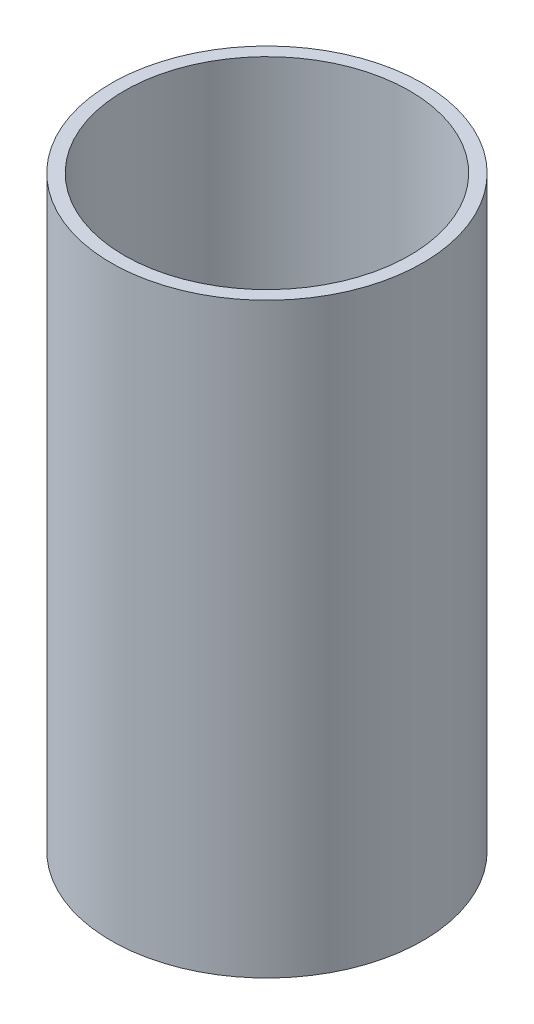
ISO-10303-21;
HEADER;
FILE_DESCRIPTION(('STEP AP214'),'2;1');
FILE_NAME('part.step','',(''),(''),'','','');
FILE_SCHEMA(('AUTOMOTIVE_DESIGN { 1 0 10303 214 1 1 1 1 }'));
ENDSEC;
DATA;
#1=APPLICATION_CONTEXT('core data for automotive mechanical design processes');
#2=APPLICATION_PROTOCOL_DEFINITION('international standard','automotive_design',2000,#1);
#3=PRODUCT_CONTEXT('',#1,'mechanical');
#4=PRODUCT('Part','Part','',(#3));
#5=PRODUCT_RELATED_PRODUCT_CATEGORY('part','',(#4));
#6=PRODUCT_DEFINITION_FORMATION('','',#4);
#7=PRODUCT_DEFINITION_CONTEXT('part definition',#1,'design');
#8=PRODUCT_DEFINITION('design','',#6,#7);
#9=PRODUCT_DEFINITION_SHAPE('','',#8);
#10=(LENGTH_UNIT() NAMED_UNIT(*) SI_UNIT(.MILLI.,.METRE.));
#11=(NAMED_UNIT(*) PLANE_ANGLE_UNIT() SI_UNIT($,.RADIAN.));
#12=(NAMED_UNIT(*) SI_UNIT($,.STERADIAN.) SOLID_ANGLE_UNIT());
#13=UNCERTAINTY_MEASURE_WITH_UNIT(LENGTH_MEASURE(1.E-05),#10,'distance_accuracy_value','');
#14=(GEOMETRIC_REPRESENTATION_CONTEXT(3) GLOBAL_UNCERTAINTY_ASSIGNED_CONTEXT((#13)) GLOBAL_UNIT_ASSIGNED_CONTEXT((#10,
#11,#12)) REPRESENTATION_CONTEXT('',''));
#15=CARTESIAN_POINT('',(0.,0.,0.));
#16=DIRECTION('',(0.,0.,1.));
#17=DIRECTION('',(1.,0.,0.));
#18=AXIS2_PLACEMENT_3D('',#15,#16,#17);
#19=CARTESIAN_POINT('',(0.,90.,0.));
#20=DIRECTION('',(0.,1.,0.));
#21=DIRECTION('',(0.,0.,1.));
#22=AXIS2_PLACEMENT_3D('',#19,#20,#21);
#23=PLANE('',#22);
#24=CARTESIAN_POINT('',(0.,90.,0.));
#25=DIRECTION('',(0.,1.,0.));
#26=DIRECTION('',(0.,0.,1.));
#27=AXIS2_PLACEMENT_3D('',#24,#25,#26);
#28=CIRCLE('',#27,23.875);
#29=CARTESIAN_POINT('',(0.,90.,-23.875));
#30=VERTEX_POINT('',#29);
#31=EDGE_CURVE('E10',#30,#30,#28,.T.);
#32=ORIENTED_EDGE('',*,*,#31,.T.);
#33=EDGE_LOOP('',(#32));
#34=FACE_BOUND('',#33,.T.);
#35=CARTESIAN_POINT('',(0.,90.,0.));
#36=DIRECTION('',(0.,1.,0.));
#37=DIRECTION('',(0.,0.,1.));
#38=AXIS2_PLACEMENT_3D('',#35,#36,#37);
#39=CIRCLE('',#38,21.875);
#40=CARTESIAN_POINT('',(0.,90.,-21.875));
#41=VERTEX_POINT('',#40);
#42=EDGE_CURVE('E50',#41,#41,#39,.T.);
#43=ORIENTED_EDGE('',*,*,#42,.F.);
#44=EDGE_LOOP('',(#43));
#45=FACE_BOUND('',#44,.T.);
#46=ADVANCED_FACE('F37',(#34,#45),#23,.T.);
#47=CARTESIAN_POINT('',(0.,0.,0.));
#48=DIRECTION('',(0.,1.,0.));
#49=DIRECTION('',(0.,0.,1.));
#50=AXIS2_PLACEMENT_3D('',#47,#48,#49);
#51=PLANE('',#50);
#52=CARTESIAN_POINT('',(0.,0.,0.));
#53=DIRECTION('',(0.,1.,0.));
#54=DIRECTION('',(0.,0.,1.));
#55=AXIS2_PLACEMENT_3D('',#52,#53,#54);
#56=CIRCLE('',#55,23.875);
#57=CARTESIAN_POINT('',(0.,0.,-23.875));
#58=VERTEX_POINT('',#57);
#59=EDGE_CURVE('E41',#58,#58,#56,.T.);
#60=ORIENTED_EDGE('',*,*,#59,.F.);
#61=EDGE_LOOP('',(#60));
#62=FACE_BOUND('',#61,.T.);
#63=CARTESIAN_POINT('',(0.,0.,0.));
#64=DIRECTION('',(0.,1.,0.));
#65=DIRECTION('',(0.,0.,1.));
#66=AXIS2_PLACEMENT_3D('',#63,#64,#65);
#67=CIRCLE('',#66,21.875);
#68=CARTESIAN_POINT('',(0.,0.,-21.875));
#69=VERTEX_POINT('',#68);
#70=EDGE_CURVE('E52',#69,#69,#67,.T.);
#71=ORIENTED_EDGE('',*,*,#70,.T.);
#72=EDGE_LOOP('',(#71));
#73=FACE_BOUND('',#72,.T.);
#74=ADVANCED_FACE('F64',(#62,#73),#51,.F.);
#75=CARTESIAN_POINT('',(0.,90.,0.));
#76=DIRECTION('',(0.,-1.,0.));
#77=DIRECTION('',(0.,0.,-1.));
#78=AXIS2_PLACEMENT_3D('',#75,#76,#77);
#79=CYLINDRICAL_SURFACE('',#78,23.875);
#80=CARTESIAN_POINT('',(0.,90.,-23.875));
#81=CARTESIAN_POINT('',(0.,89.0625,-23.875));
#82=CARTESIAN_POINT('',(0.,88.125,-23.875));
#83=CARTESIAN_POINT('',(0.,86.25,-23.875));
#84=CARTESIAN_POINT('',(0.,85.3125,-23.875));
#85=CARTESIAN_POINT('',(0.,83.4375,-23.875));
#86=CARTESIAN_POINT('',(0.,82.5,-23.875));
#87=CARTESIAN_POINT('',(0.,80.625,-23.875));
#88=CARTESIAN_POINT('',(0.,79.6875,-23.875));
#89=CARTESIAN_POINT('',(0.,77.8125,-23.875));
#90=CARTESIAN_POINT('',(0.,76.875,-23.875));
#91=CARTESIAN_POINT('',(0.,75.,-23.875));
#92=CARTESIAN_POINT('',(0.,74.0625,-23.875));
#93=CARTESIAN_POINT('',(0.,72.1875,-23.875));
#94=CARTESIAN_POINT('',(0.,71.25,-23.875));
#95=CARTESIAN_POINT('',(0.,69.375,-23.875));
#96=CARTESIAN_POINT('',(0.,68.4375,-23.875));
#97=CARTESIAN_POINT('',(0.,66.5625,-23.875));
#98=CARTESIAN_POINT('',(0.,65.625,-23.875));
#99=CARTESIAN_POINT('',(0.,63.75,-23.875));
#100=CARTESIAN_POINT('',(0.,62.8125,-23.875));
#101=CARTESIAN_POINT('',(0.,60.9375,-23.875));
#102=CARTESIAN_POINT('',(0.,60.,-23.875));
#103=CARTESIAN_POINT('',(0.,58.125,-23.875));
#104=CARTESIAN_POINT('',(0.,57.1875,-23.875));
#105=CARTESIAN_POINT('',(0.,55.3125,-23.875));
#106=CARTESIAN_POINT('',(0.,54.375,-23.875));
#107=CARTESIAN_POINT('',(0.,52.5,-23.875));
#108=CARTESIAN_POINT('',(0.,51.5625,-23.875));
#109=CARTESIAN_POINT('',(0.,49.6875,-23.875));
#110=CARTESIAN_POINT('',(0.,48.75,-23.875));
#111=CARTESIAN_POINT('',(0.,46.875,-23.875));
#112=CARTESIAN_POINT('',(0.,45.9375,-23.875));
#113=CARTESIAN_POINT('',(0.,44.0625,-23.875));
#114=CARTESIAN_POINT('',(0.,43.125,-23.875));
#115=CARTESIAN_POINT('',(0.,41.25,-23.875));
#116=CARTESIAN_POINT('',(0.,40.3125,-23.875));
#117=CARTESIAN_POINT('',(0.,38.4375,-23.875));
#118=CARTESIAN_POINT('',(0.,37.5,-23.875));
#119=CARTESIAN_POINT('',(0.,35.625,-23.875));
#120=CARTESIAN_POINT('',(0.,34.6875,-23.875));
#121=CARTESIAN_POINT('',(0.,32.8125,-23.875));
#122=CARTESIAN_POINT('',(0.,31.875,-23.875));
#123=CARTESIAN_POINT('',(0.,30.,-23.875));
#124=CARTESIAN_POINT('',(0.,29.0625,-23.875));
#125=CARTESIAN_POINT('',(0.,27.1875,-23.875));
#126=CARTESIAN_POINT('',(0.,26.25,-23.875));
#127=CARTESIAN_POINT('',(0.,24.375,-23.875));
#128=CARTESIAN_POINT('',(0.,23.4375,-23.875));
#129=CARTESIAN_POINT('',(0.,21.5625,-23.875));
#130=CARTESIAN_POINT('',(0.,20.625,-23.875));
#131=CARTESIAN_POINT('',(0.,18.75,-23.875));
#132=CARTESIAN_POINT('',(0.,17.8125,-23.875));
#133=CARTESIAN_POINT('',(0.,15.9375,-23.875));
#134=CARTESIAN_POINT('',(0.,15.,-23.875));
#135=CARTESIAN_POINT('',(0.,13.125,-23.875));
#136=CARTESIAN_POINT('',(0.,12.1875,-23.875));
#137=CARTESIAN_POINT('',(0.,10.3125,-23.875));
#138=CARTESIAN_POINT('',(0.,9.37499999999999,-23.875));
#139=CARTESIAN_POINT('',(0.,7.49999999999999,-23.875));
#140=CARTESIAN_POINT('',(0.,6.56249999999999,-23.875));
#141=CARTESIAN_POINT('',(0.,4.68749999999999,-23.875));
#142=CARTESIAN_POINT('',(0.,3.74999999999998,-23.875));
#143=CARTESIAN_POINT('',(0.,1.87499999999998,-23.875));
#144=CARTESIAN_POINT('',(0.,0.937499999999986,-23.875));
#145=CARTESIAN_POINT('',(0.,0.,-23.875));
#146=B_SPLINE_CURVE_WITH_KNOTS('',3,(#80,#81,#82,#83,#84,#85,#86,#87,#88,#89,#90,#91,#92,#93,
#94,#95,#96,#97,#98,#99,#100,#101,#102,#103,#104,#105,#106,#107,#108,#109,#110,#111,#112,#113,
#114,#115,#116,#117,#118,#119,#120,#121,#122,#123,#124,#125,#126,#127,#128,#129,#130,#131,#132,
#133,#134,#135,#136,#137,#138,#139,#140,#141,#142,#143,#144,#145),.UNSPECIFIED.,.F.,.F.,(4,2,2,
2,2,2,2,2,2,2,2,2,2,2,2,2,2,2,2,2,2,2,2,2,2,2,2,2,2,2,2,2,4),(0.,2.8125,5.62499999999999,
8.43749999999999,11.25,14.0625,16.875,19.6875,22.5,25.3125,28.125,30.9375,33.75,36.5625,39.375,
42.1875,45.,47.8125,50.625,53.4375,56.25,59.0625,61.875,64.6875,67.5,70.3125,73.125,75.9375,
78.75,81.5625,84.375,87.1875,90.),.UNSPECIFIED.);
#147=EDGE_CURVE('BSEAM39',#30,#58,#146,.T.);
#148=ORIENTED_EDGE('',*,*,#31,.F.);
#149=ORIENTED_EDGE('',*,*,#59,.T.);
#150=ORIENTED_EDGE('',*,*,#147,.T.);
#151=ORIENTED_EDGE('',*,*,#147,.F.);
#152=EDGE_LOOP('',(#148,#150,#149,#151));
#153=FACE_BOUND('',#152,.T.);
#154=ADVANCED_FACE('F39',(#153),#79,.T.);
#155=CARTESIAN_POINT('',(0.,90.,0.));
#156=DIRECTION('',(0.,-1.,0.));
#157=DIRECTION('',(0.,0.,-1.));
#158=AXIS2_PLACEMENT_3D('',#155,#156,#157);
#159=CYLINDRICAL_SURFACE('',#158,21.875);
#160=CARTESIAN_POINT('',(0.,90.,-21.875));
#161=CARTESIAN_POINT('',(0.,89.0625,-21.875));
#162=CARTESIAN_POINT('',(0.,88.125,-21.875));
#163=CARTESIAN_POINT('',(0.,86.25,-21.875));
#164=CARTESIAN_POINT('',(0.,85.3125,-21.875));
#165=CARTESIAN_POINT('',(0.,83.4375,-21.875));
#166=CARTESIAN_POINT('',(0.,82.5,-21.875));
#167=CARTESIAN_POINT('',(0.,80.625,-21.875));
#168=CARTESIAN_POINT('',(0.,79.6875,-21.875));
#169=CARTESIAN_POINT('',(0.,77.8125,-21.875));
#170=CARTESIAN_POINT('',(0.,76.875,-21.875));
#171=CARTESIAN_POINT('',(0.,75.,-21.875));
#172=CARTESIAN_POINT('',(0.,74.0625,-21.875));
#173=CARTESIAN_POINT('',(0.,72.1875,-21.875));
#174=CARTESIAN_POINT('',(0.,71.25,-21.875));
#175=CARTESIAN_POINT('',(0.,69.375,-21.875));
#176=CARTESIAN_POINT('',(0.,68.4375,-21.875));
#177=CARTESIAN_POINT('',(0.,66.5625,-21.875));
#178=CARTESIAN_POINT('',(0.,65.625,-21.875));
#179=CARTESIAN_POINT('',(0.,63.75,-21.875));
#180=CARTESIAN_POINT('',(0.,62.8125,-21.875));
#181=CARTESIAN_POINT('',(0.,60.9375,-21.875));
#182=CARTESIAN_POINT('',(0.,60.,-21.875));
#183=CARTESIAN_POINT('',(0.,58.125,-21.875));
#184=CARTESIAN_POINT('',(0.,57.1875,-21.875));
#185=CARTESIAN_POINT('',(0.,55.3125,-21.875));
#186=CARTESIAN_POINT('',(0.,54.375,-21.875));
#187=CARTESIAN_POINT('',(0.,52.5,-21.875));
#188=CARTESIAN_POINT('',(0.,51.5625,-21.875));
#189=CARTESIAN_POINT('',(0.,49.6875,-21.875));
#190=CARTESIAN_POINT('',(0.,48.75,-21.875));
#191=CARTESIAN_POINT('',(0.,46.875,-21.875));
#192=CARTESIAN_POINT('',(0.,45.9375,-21.875));
#193=CARTESIAN_POINT('',(0.,44.0625,-21.875));
#194=CARTESIAN_POINT('',(0.,43.125,-21.875));
#195=CARTESIAN_POINT('',(0.,41.25,-21.875));
#196=CARTESIAN_POINT('',(0.,40.3125,-21.875));
#197=CARTESIAN_POINT('',(0.,38.4375,-21.875));
#198=CARTESIAN_POINT('',(0.,37.5,-21.875));
#199=CARTESIAN_POINT('',(0.,35.625,-21.875));
#200=CARTESIAN_POINT('',(0.,34.6875,-21.875));
#201=CARTESIAN_POINT('',(0.,32.8125,-21.875));
#202=CARTESIAN_POINT('',(0.,31.875,-21.875));
#203=CARTESIAN_POINT('',(0.,30.,-21.875));
#204=CARTESIAN_POINT('',(0.,29.0625,-21.875));
#205=CARTESIAN_POINT('',(0.,27.1875,-21.875));
#206=CARTESIAN_POINT('',(0.,26.25,-21.875));
#207=CARTESIAN_POINT('',(0.,24.375,-21.875));
#208=CARTESIAN_POINT('',(0.,23.4375,-21.875));
#209=CARTESIAN_POINT('',(0.,21.5625,-21.875));
#210=CARTESIAN_POINT('',(0.,20.625,-21.875));
#211=CARTESIAN_POINT('',(0.,18.75,-21.875));
#212=CARTESIAN_POINT('',(0.,17.8125,-21.875));
#213=CARTESIAN_POINT('',(0.,15.9375,-21.875));
#214=CARTESIAN_POINT('',(0.,15.,-21.875));
#215=CARTESIAN_POINT('',(0.,13.125,-21.875));
#216=CARTESIAN_POINT('',(0.,12.1875,-21.875));
#217=CARTESIAN_POINT('',(0.,10.3125,-21.875));
#218=CARTESIAN_POINT('',(0.,9.37499999999999,-21.875));
#219=CARTESIAN_POINT('',(0.,7.49999999999999,-21.875));
#220=CARTESIAN_POINT('',(0.,6.56249999999999,-21.875));
#221=CARTESIAN_POINT('',(0.,4.68749999999999,-21.875));
#222=CARTESIAN_POINT('',(0.,3.74999999999998,-21.875));
#223=CARTESIAN_POINT('',(0.,1.87499999999998,-21.875));
#224=CARTESIAN_POINT('',(0.,0.937499999999986,-21.875));
#225=CARTESIAN_POINT('',(0.,0.,-21.875));
#226=B_SPLINE_CURVE_WITH_KNOTS('',3,(#160,#161,#162,#163,#164,#165,#166,#167,#168,#169,#170,
#171,#172,#173,#174,#175,#176,#177,#178,#179,#180,#181,#182,#183,#184,#185,#186,#187,#188,#189,
#190,#191,#192,#193,#194,#195,#196,#197,#198,#199,#200,#201,#202,#203,#204,#205,#206,#207,#208,
#209,#210,#211,#212,#213,#214,#215,#216,#217,#218,#219,#220,#221,#222,#223,#224,#225),
.UNSPECIFIED.,.F.,.F.,(4,2,2,2,2,2,2,2,2,2,2,2,2,2,2,2,2,2,2,2,2,2,2,2,2,2,2,2,2,2,2,2,4),(0.,
2.81250000000001,5.62500000000001,8.43750000000001,11.25,14.0625,16.875,19.6875,22.5,25.3125,
28.125,30.9375,33.75,36.5625,39.375,42.1875,45.,47.8125,50.625,53.4375,56.25,59.0625,61.875,
64.6875,67.5,70.3125,73.125,75.9375,78.75,81.5625,84.375,87.1875,90.),.UNSPECIFIED.);
#227=EDGE_CURVE('BSEAM60',#41,#69,#226,.T.);
#228=ORIENTED_EDGE('',*,*,#42,.T.);
#229=ORIENTED_EDGE('',*,*,#70,.F.);
#230=ORIENTED_EDGE('',*,*,#227,.T.);
#231=ORIENTED_EDGE('',*,*,#227,.F.);
#232=EDGE_LOOP('',(#228,#230,#229,#231));
#233=FACE_BOUND('',#232,.T.);
#234=ADVANCED_FACE('F60',(#233),#159,.F.);
#235=CLOSED_SHELL('',(#46,#74,#154,#234));
#236=MANIFOLD_SOLID_BREP('B2',#235);
#237=ADVANCED_BREP_SHAPE_REPRESENTATION('',(#18,#236),#14);
#238=SHAPE_DEFINITION_REPRESENTATION(#9,#237);
ENDSEC;
END-ISO-10303-21;
